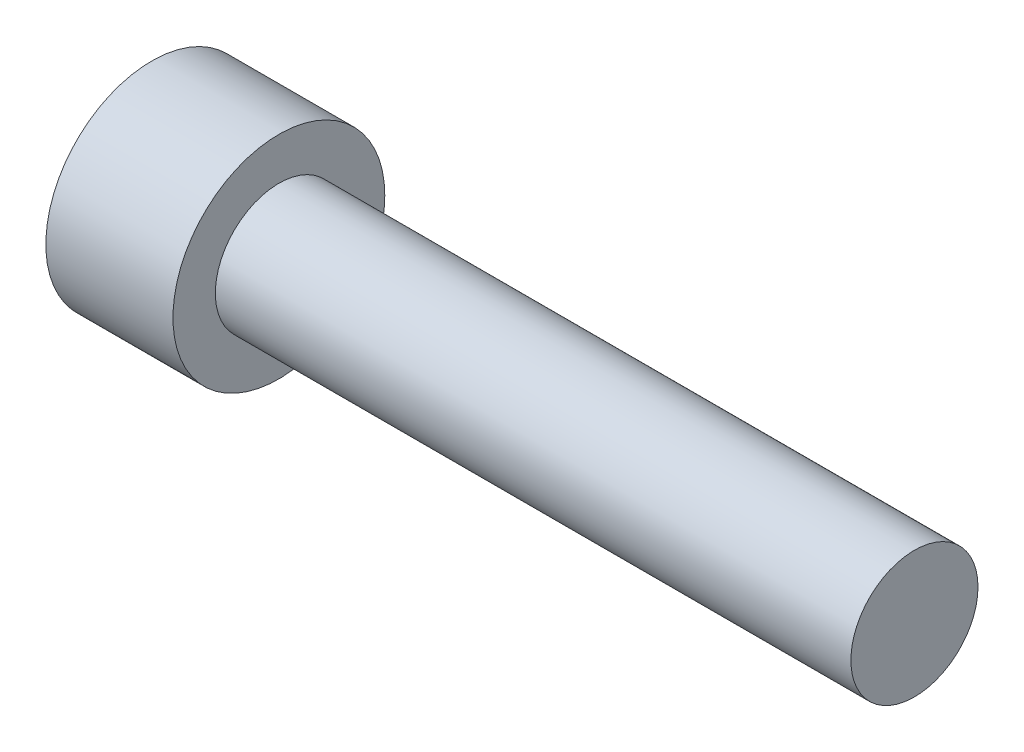
ISO-10303-21;
HEADER;
FILE_DESCRIPTION(('STEP AP214'),'2;1');
FILE_NAME('part.step','',(''),(''),'','','');
FILE_SCHEMA(('AUTOMOTIVE_DESIGN { 1 0 10303 214 1 1 1 1 }'));
ENDSEC;
DATA;
#1=APPLICATION_CONTEXT('core data for automotive mechanical design processes');
#2=APPLICATION_PROTOCOL_DEFINITION('international standard','automotive_design',2000,#1);
#3=PRODUCT_CONTEXT('',#1,'mechanical');
#4=PRODUCT('Part','Part','',(#3));
#5=PRODUCT_RELATED_PRODUCT_CATEGORY('part','',(#4));
#6=PRODUCT_DEFINITION_FORMATION('','',#4);
#7=PRODUCT_DEFINITION_CONTEXT('part definition',#1,'design');
#8=PRODUCT_DEFINITION('design','',#6,#7);
#9=PRODUCT_DEFINITION_SHAPE('','',#8);
#10=(LENGTH_UNIT() NAMED_UNIT(*) SI_UNIT(.MILLI.,.METRE.));
#11=(NAMED_UNIT(*) PLANE_ANGLE_UNIT() SI_UNIT($,.RADIAN.));
#12=(NAMED_UNIT(*) SI_UNIT($,.STERADIAN.) SOLID_ANGLE_UNIT());
#13=UNCERTAINTY_MEASURE_WITH_UNIT(LENGTH_MEASURE(1.E-05),#10,'distance_accuracy_value','');
#14=(GEOMETRIC_REPRESENTATION_CONTEXT(3) GLOBAL_UNCERTAINTY_ASSIGNED_CONTEXT((#13)) GLOBAL_UNIT_ASSIGNED_CONTEXT((#10,
#11,#12)) REPRESENTATION_CONTEXT('',''));
#15=CARTESIAN_POINT('',(0.,0.,0.));
#16=DIRECTION('',(0.,0.,1.));
#17=DIRECTION('',(1.,0.,0.));
#18=AXIS2_PLACEMENT_3D('',#15,#16,#17);
#19=CARTESIAN_POINT('',(0.,0.,0.));
#20=DIRECTION('',(-1.,0.,0.));
#21=DIRECTION('',(0.,0.,1.));
#22=AXIS2_PLACEMENT_3D('',#19,#20,#21);
#23=PLANE('',#22);
#24=CARTESIAN_POINT('',(0.,0.,0.));
#25=DIRECTION('',(1.,0.,0.));
#26=DIRECTION('',(0.,0.,-1.));
#27=AXIS2_PLACEMENT_3D('',#24,#25,#26);
#28=CIRCLE('',#27,2.5);
#29=CARTESIAN_POINT('',(0.,0.,-2.5));
#30=VERTEX_POINT('',#29);
#31=EDGE_CURVE('E10',#30,#30,#28,.T.);
#32=ORIENTED_EDGE('',*,*,#31,.F.);
#33=EDGE_LOOP('',(#32));
#34=FACE_BOUND('',#33,.T.);
#35=ADVANCED_FACE('F37',(#34),#23,.T.);
#36=CARTESIAN_POINT('',(18.,0.,0.));
#37=DIRECTION('',(1.,0.,0.));
#38=DIRECTION('',(0.,0.,-1.));
#39=AXIS2_PLACEMENT_3D('',#36,#37,#38);
#40=CYLINDRICAL_SURFACE('',#39,2.5);
#41=ORIENTED_EDGE('',*,*,#31,.T.);
#42=EDGE_LOOP('',(#41));
#43=FACE_BOUND('',#42,.T.);
#44=CARTESIAN_POINT('',(3.,0.,0.));
#45=DIRECTION('',(1.,0.,0.));
#46=DIRECTION('',(0.,0.,-1.));
#47=AXIS2_PLACEMENT_3D('',#44,#45,#46);
#48=CIRCLE('',#47,2.5);
#49=CARTESIAN_POINT('',(3.,0.,-2.5));
#50=VERTEX_POINT('',#49);
#51=EDGE_CURVE('E44',#50,#50,#48,.T.);
#52=ORIENTED_EDGE('',*,*,#51,.F.);
#53=EDGE_LOOP('',(#52));
#54=FACE_BOUND('',#53,.T.);
#55=ADVANCED_FACE('F73',(#43,#54),#40,.T.);
#56=CARTESIAN_POINT('',(3.,0.,-2.5));
#57=DIRECTION('',(1.,0.,0.));
#58=DIRECTION('',(0.,0.,-1.));
#59=AXIS2_PLACEMENT_3D('',#56,#57,#58);
#60=PLANE('',#59);
#61=ORIENTED_EDGE('',*,*,#51,.T.);
#62=EDGE_LOOP('',(#61));
#63=FACE_BOUND('',#62,.T.);
#64=CARTESIAN_POINT('',(3.,0.,0.));
#65=DIRECTION('',(1.,0.,0.));
#66=DIRECTION('',(0.,0.,-1.));
#67=AXIS2_PLACEMENT_3D('',#64,#65,#66);
#68=CIRCLE('',#67,1.5);
#69=CARTESIAN_POINT('',(3.,0.,-1.5));
#70=VERTEX_POINT('',#69);
#71=EDGE_CURVE('E49',#70,#70,#68,.T.);
#72=ORIENTED_EDGE('',*,*,#71,.F.);
#73=EDGE_LOOP('',(#72));
#74=FACE_BOUND('',#73,.T.);
#75=ADVANCED_FACE('F65',(#63,#74),#60,.T.);
#76=CARTESIAN_POINT('',(18.,0.,0.));
#77=DIRECTION('',(1.,0.,0.));
#78=DIRECTION('',(0.,0.,-1.));
#79=AXIS2_PLACEMENT_3D('',#76,#77,#78);
#80=CYLINDRICAL_SURFACE('',#79,1.5);
#81=ORIENTED_EDGE('',*,*,#71,.T.);
#82=EDGE_LOOP('',(#81));
#83=FACE_BOUND('',#82,.T.);
#84=CARTESIAN_POINT('',(18.,0.,0.));
#85=DIRECTION('',(1.,0.,0.));
#86=DIRECTION('',(0.,0.,-1.));
#87=AXIS2_PLACEMENT_3D('',#84,#85,#86);
#88=CIRCLE('',#87,1.5);
#89=CARTESIAN_POINT('',(18.,0.,-1.5));
#90=VERTEX_POINT('',#89);
#91=EDGE_CURVE('E54',#90,#90,#88,.T.);
#92=ORIENTED_EDGE('',*,*,#91,.F.);
#93=EDGE_LOOP('',(#92));
#94=FACE_BOUND('',#93,.T.);
#95=ADVANCED_FACE('F63',(#83,#94),#80,.T.);
#96=CARTESIAN_POINT('',(18.,0.,-1.5));
#97=DIRECTION('',(1.,0.,0.));
#98=DIRECTION('',(0.,0.,-1.));
#99=AXIS2_PLACEMENT_3D('',#96,#97,#98);
#100=PLANE('',#99);
#101=ORIENTED_EDGE('',*,*,#91,.T.);
#102=EDGE_LOOP('',(#101));
#103=FACE_BOUND('',#102,.T.);
#104=ADVANCED_FACE('F61',(#103),#100,.T.);
#105=CLOSED_SHELL('',(#35,#55,#75,#95,#104));
#106=MANIFOLD_SOLID_BREP('B2',#105);
#107=ADVANCED_BREP_SHAPE_REPRESENTATION('',(#18,#106),#14);
#108=SHAPE_DEFINITION_REPRESENTATION(#9,#107);
ENDSEC;
END-ISO-10303-21;
